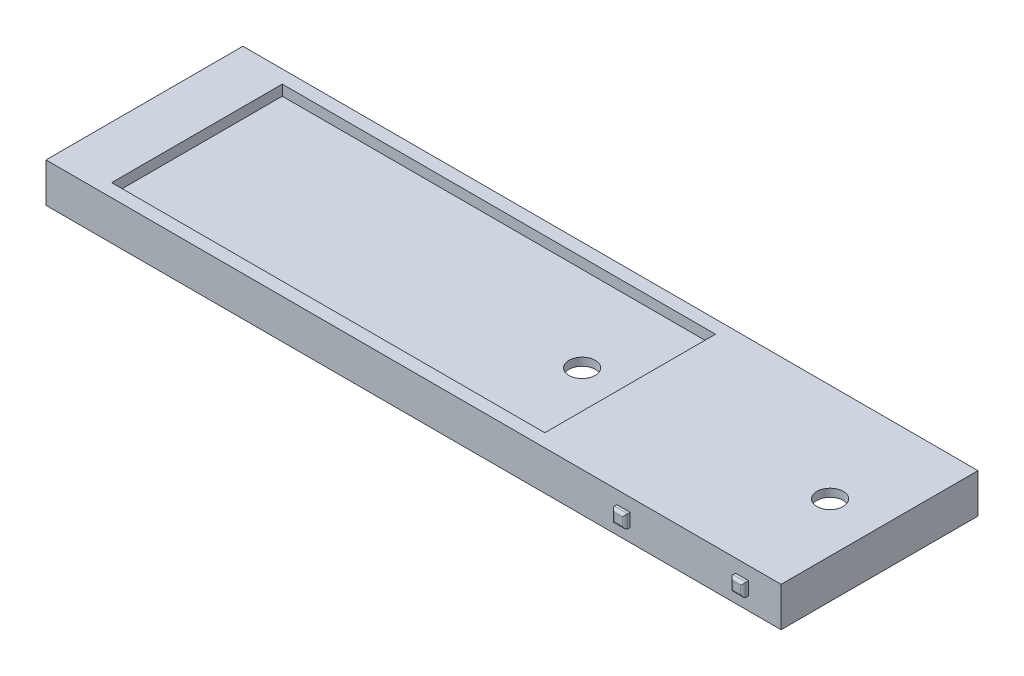
ISO-10303-21;
HEADER;
FILE_DESCRIPTION(('STEP AP214'),'2;1');
FILE_NAME('part.step','',(''),(''),'','','');
FILE_SCHEMA(('AUTOMOTIVE_DESIGN { 1 0 10303 214 1 1 1 1 }'));
ENDSEC;
DATA;
#1=APPLICATION_CONTEXT('core data for automotive mechanical design processes');
#2=APPLICATION_PROTOCOL_DEFINITION('international standard','automotive_design',2000,#1);
#3=PRODUCT_CONTEXT('',#1,'mechanical');
#4=PRODUCT('Part','Part','',(#3));
#5=PRODUCT_RELATED_PRODUCT_CATEGORY('part','',(#4));
#6=PRODUCT_DEFINITION_FORMATION('','',#4);
#7=PRODUCT_DEFINITION_CONTEXT('part definition',#1,'design');
#8=PRODUCT_DEFINITION('design','',#6,#7);
#9=PRODUCT_DEFINITION_SHAPE('','',#8);
#10=(LENGTH_UNIT() NAMED_UNIT(*) SI_UNIT(.MILLI.,.METRE.));
#11=(NAMED_UNIT(*) PLANE_ANGLE_UNIT() SI_UNIT($,.RADIAN.));
#12=(NAMED_UNIT(*) SI_UNIT($,.STERADIAN.) SOLID_ANGLE_UNIT());
#13=UNCERTAINTY_MEASURE_WITH_UNIT(LENGTH_MEASURE(1.E-05),#10,'distance_accuracy_value','');
#14=(GEOMETRIC_REPRESENTATION_CONTEXT(3) GLOBAL_UNCERTAINTY_ASSIGNED_CONTEXT((#13)) GLOBAL_UNIT_ASSIGNED_CONTEXT((#10,
#11,#12)) REPRESENTATION_CONTEXT('',''));
#15=CARTESIAN_POINT('',(0.,0.,0.));
#16=DIRECTION('',(0.,0.,1.));
#17=DIRECTION('',(1.,0.,0.));
#18=AXIS2_PLACEMENT_3D('',#15,#16,#17);
#19=CARTESIAN_POINT('',(-140.,15.,37.5));
#20=DIRECTION('',(0.,0.,-1.));
#21=DIRECTION('',(-1.,0.,0.));
#22=AXIS2_PLACEMENT_3D('',#19,#20,#21);
#23=PLANE('',#22);
#24=DIRECTION('',(0.,1.,0.));
#25=VECTOR('',#24,1.);
#26=CARTESIAN_POINT('',(82.5000000000001,10.,37.5));
#27=LINE('',#26,#25);
#28=CARTESIAN_POINT('',(82.5000000000001,5.,37.5));
#29=VERTEX_POINT('',#28);
#30=CARTESIAN_POINT('',(82.5000000000001,10.,37.5));
#31=VERTEX_POINT('',#30);
#32=EDGE_CURVE('E254',#29,#31,#27,.T.);
#33=ORIENTED_EDGE('',*,*,#32,.F.);
#34=DIRECTION('',(1.,0.,0.));
#35=VECTOR('',#34,1.);
#36=CARTESIAN_POINT('',(77.5000000000001,5.,37.5));
#37=LINE('',#36,#35);
#38=CARTESIAN_POINT('',(77.5000000000001,5.,37.5));
#39=VERTEX_POINT('',#38);
#40=EDGE_CURVE('E272',#39,#29,#37,.T.);
#41=ORIENTED_EDGE('',*,*,#40,.F.);
#42=DIRECTION('',(0.,-1.,0.));
#43=VECTOR('',#42,1.);
#44=CARTESIAN_POINT('',(77.5000000000001,10.,37.5));
#45=LINE('',#44,#43);
#46=CARTESIAN_POINT('',(77.5000000000001,10.,37.5));
#47=VERTEX_POINT('',#46);
#48=EDGE_CURVE('E269',#47,#39,#45,.T.);
#49=ORIENTED_EDGE('',*,*,#48,.F.);
#50=DIRECTION('',(-1.,0.,0.));
#51=VECTOR('',#50,1.);
#52=CARTESIAN_POINT('',(77.5000000000001,10.,37.5));
#53=LINE('',#52,#51);
#54=EDGE_CURVE('E266',#31,#47,#53,.T.);
#55=ORIENTED_EDGE('',*,*,#54,.F.);
#56=EDGE_LOOP('',(#33,#41,#49,#55));
#57=FACE_BOUND('',#56,.T.);
#58=DIRECTION('',(1.,0.,0.));
#59=VECTOR('',#58,1.);
#60=CARTESIAN_POINT('',(-140.,0.,37.5));
#61=LINE('',#60,#59);
#62=CARTESIAN_POINT('',(-140.,0.,37.5));
#63=VERTEX_POINT('',#62);
#64=CARTESIAN_POINT('',(140.,0.,37.5));
#65=VERTEX_POINT('',#64);
#66=EDGE_CURVE('E391',#63,#65,#61,.T.);
#67=ORIENTED_EDGE('',*,*,#66,.T.);
#68=DIRECTION('',(0.,-1.,0.));
#69=VECTOR('',#68,1.);
#70=CARTESIAN_POINT('',(140.,15.,37.5));
#71=LINE('',#70,#69);
#72=CARTESIAN_POINT('',(140.,15.,37.5));
#73=VERTEX_POINT('',#72);
#74=EDGE_CURVE('E397',#73,#65,#71,.T.);
#75=ORIENTED_EDGE('',*,*,#74,.F.);
#76=DIRECTION('',(1.,0.,0.));
#77=VECTOR('',#76,1.);
#78=CARTESIAN_POINT('',(-140.,15.,37.5));
#79=LINE('',#78,#77);
#80=CARTESIAN_POINT('',(-140.,15.,37.5));
#81=VERTEX_POINT('',#80);
#82=EDGE_CURVE('E395',#81,#73,#79,.T.);
#83=ORIENTED_EDGE('',*,*,#82,.F.);
#84=DIRECTION('',(0.,-1.,0.));
#85=VECTOR('',#84,1.);
#86=CARTESIAN_POINT('',(-140.,15.,37.5));
#87=LINE('',#86,#85);
#88=EDGE_CURVE('E409',#81,#63,#87,.T.);
#89=ORIENTED_EDGE('',*,*,#88,.T.);
#90=EDGE_LOOP('',(#67,#75,#83,#89));
#91=FACE_BOUND('',#90,.T.);
#92=DIRECTION('',(0.,1.,0.));
#93=VECTOR('',#92,1.);
#94=CARTESIAN_POINT('',(127.624035554911,10.,37.5));
#95=LINE('',#94,#93);
#96=CARTESIAN_POINT('',(127.624035554911,5.,37.5));
#97=VERTEX_POINT('',#96);
#98=CARTESIAN_POINT('',(127.624035554912,10.,37.5));
#99=VERTEX_POINT('',#98);
#100=EDGE_CURVE('E237',#97,#99,#95,.T.);
#101=ORIENTED_EDGE('',*,*,#100,.F.);
#102=DIRECTION('',(1.,0.,0.));
#103=VECTOR('',#102,1.);
#104=CARTESIAN_POINT('',(122.624035554911,5.,37.5));
#105=LINE('',#104,#103);
#106=CARTESIAN_POINT('',(122.624035554911,5.,37.5));
#107=VERTEX_POINT('',#106);
#108=EDGE_CURVE('E244',#107,#97,#105,.T.);
#109=ORIENTED_EDGE('',*,*,#108,.F.);
#110=DIRECTION('',(0.,-1.,0.));
#111=VECTOR('',#110,1.);
#112=CARTESIAN_POINT('',(122.624035554911,10.,37.5));
#113=LINE('',#112,#111);
#114=CARTESIAN_POINT('',(122.624035554911,10.,37.5));
#115=VERTEX_POINT('',#114);
#116=EDGE_CURVE('E258',#115,#107,#113,.T.);
#117=ORIENTED_EDGE('',*,*,#116,.F.);
#118=DIRECTION('',(-1.,0.,0.));
#119=VECTOR('',#118,1.);
#120=CARTESIAN_POINT('',(122.624035554911,10.,37.5));
#121=LINE('',#120,#119);
#122=EDGE_CURVE('E253',#99,#115,#121,.T.);
#123=ORIENTED_EDGE('',*,*,#122,.F.);
#124=EDGE_LOOP('',(#101,#109,#117,#123));
#125=FACE_BOUND('',#124,.T.);
#126=ADVANCED_FACE('F47',(#57,#91,#125),#23,.F.);
#127=CARTESIAN_POINT('',(121.166163262817,0.,0.));
#128=DIRECTION('',(0.,1.,0.));
#129=DIRECTION('',(0.,0.,1.));
#130=AXIS2_PLACEMENT_3D('',#127,#128,#129);
#131=CYLINDRICAL_SURFACE('',#130,5.);
#132=CARTESIAN_POINT('',(121.166163262817,15.,0.));
#133=DIRECTION('',(0.,1.,0.));
#134=DIRECTION('',(0.,0.,1.));
#135=AXIS2_PLACEMENT_3D('',#132,#133,#134);
#136=CIRCLE('',#135,5.);
#137=CARTESIAN_POINT('',(121.166163262817,15.,5.));
#138=VERTEX_POINT('',#137);
#139=EDGE_CURVE('E383',#138,#138,#136,.T.);
#140=ORIENTED_EDGE('',*,*,#139,.T.);
#141=EDGE_LOOP('',(#140));
#142=FACE_BOUND('',#141,.T.);
#143=CARTESIAN_POINT('',(121.166163262817,12.,0.));
#144=DIRECTION('',(0.,1.,0.));
#145=DIRECTION('',(0.,0.,1.));
#146=AXIS2_PLACEMENT_3D('',#143,#144,#145);
#147=CIRCLE('',#146,5.);
#148=CARTESIAN_POINT('',(121.166163262817,12.,5.));
#149=VERTEX_POINT('',#148);
#150=EDGE_CURVE('E321',#149,#149,#147,.T.);
#151=ORIENTED_EDGE('',*,*,#150,.F.);
#152=EDGE_LOOP('',(#151));
#153=FACE_BOUND('',#152,.T.);
#154=ADVANCED_FACE('F505',(#142,#153),#131,.F.);
#155=CARTESIAN_POINT('',(26.6982684733857,0.,0.));
#156=DIRECTION('',(0.,1.,0.));
#157=DIRECTION('',(0.,0.,1.));
#158=AXIS2_PLACEMENT_3D('',#155,#156,#157);
#159=CYLINDRICAL_SURFACE('',#158,5.);
#160=CARTESIAN_POINT('',(26.6982684733857,8.,0.));
#161=DIRECTION('',(0.,1.,0.));
#162=DIRECTION('',(0.,0.,1.));
#163=AXIS2_PLACEMENT_3D('',#160,#161,#162);
#164=CIRCLE('',#163,5.);
#165=CARTESIAN_POINT('',(26.6982684733857,8.,5.));
#166=VERTEX_POINT('',#165);
#167=EDGE_CURVE('E316',#166,#166,#164,.F.);
#168=ORIENTED_EDGE('',*,*,#167,.T.);
#169=EDGE_LOOP('',(#168));
#170=FACE_BOUND('',#169,.T.);
#171=CARTESIAN_POINT('',(26.6982684733857,11.,0.));
#172=DIRECTION('',(0.,1.,0.));
#173=DIRECTION('',(0.,0.,1.));
#174=AXIS2_PLACEMENT_3D('',#171,#172,#173);
#175=CIRCLE('',#174,5.);
#176=CARTESIAN_POINT('',(26.6982684733857,11.,5.));
#177=VERTEX_POINT('',#176);
#178=EDGE_CURVE('E376',#177,#177,#175,.F.);
#179=ORIENTED_EDGE('',*,*,#178,.F.);
#180=EDGE_LOOP('',(#179));
#181=FACE_BOUND('',#180,.T.);
#182=ADVANCED_FACE('F513',(#170,#181),#159,.F.);
#183=CARTESIAN_POINT('',(140.,15.,-37.5));
#184=DIRECTION('',(-1.,0.,0.));
#185=DIRECTION('',(0.,0.,1.));
#186=AXIS2_PLACEMENT_3D('',#183,#184,#185);
#187=PLANE('',#186);
#188=DIRECTION('',(0.,0.,-1.));
#189=VECTOR('',#188,1.);
#190=CARTESIAN_POINT('',(140.,0.,-37.5));
#191=LINE('',#190,#189);
#192=CARTESIAN_POINT('',(140.,0.,-37.5));
#193=VERTEX_POINT('',#192);
#194=EDGE_CURVE('E386',#65,#193,#191,.T.);
#195=ORIENTED_EDGE('',*,*,#194,.T.);
#196=DIRECTION('',(0.,-1.,0.));
#197=VECTOR('',#196,1.);
#198=CARTESIAN_POINT('',(140.,15.,-37.5));
#199=LINE('',#198,#197);
#200=CARTESIAN_POINT('',(140.,15.,-37.5));
#201=VERTEX_POINT('',#200);
#202=EDGE_CURVE('E415',#201,#193,#199,.T.);
#203=ORIENTED_EDGE('',*,*,#202,.F.);
#204=DIRECTION('',(0.,0.,-1.));
#205=VECTOR('',#204,1.);
#206=CARTESIAN_POINT('',(140.,15.,-37.5));
#207=LINE('',#206,#205);
#208=EDGE_CURVE('E387',#73,#201,#207,.T.);
#209=ORIENTED_EDGE('',*,*,#208,.F.);
#210=ORIENTED_EDGE('',*,*,#74,.T.);
#211=EDGE_LOOP('',(#195,#203,#209,#210));
#212=FACE_BOUND('',#211,.T.);
#213=ADVANCED_FACE('F529',(#212),#187,.F.);
#214=CARTESIAN_POINT('',(-140.,15.,-37.5));
#215=DIRECTION('',(0.,0.,1.));
#216=DIRECTION('',(1.,0.,0.));
#217=AXIS2_PLACEMENT_3D('',#214,#215,#216);
#218=PLANE('',#217);
#219=DIRECTION('',(-1.,0.,0.));
#220=VECTOR('',#219,1.);
#221=CARTESIAN_POINT('',(-140.,0.,-37.5));
#222=LINE('',#221,#220);
#223=CARTESIAN_POINT('',(-140.,0.,-37.5));
#224=VERTEX_POINT('',#223);
#225=EDGE_CURVE('E400',#193,#224,#222,.T.);
#226=ORIENTED_EDGE('',*,*,#225,.T.);
#227=DIRECTION('',(0.,-1.,0.));
#228=VECTOR('',#227,1.);
#229=CARTESIAN_POINT('',(-140.,15.,-37.5));
#230=LINE('',#229,#228);
#231=CARTESIAN_POINT('',(-140.,15.,-37.5));
#232=VERTEX_POINT('',#231);
#233=EDGE_CURVE('E412',#232,#224,#230,.T.);
#234=ORIENTED_EDGE('',*,*,#233,.F.);
#235=DIRECTION('',(-1.,0.,0.));
#236=VECTOR('',#235,1.);
#237=CARTESIAN_POINT('',(-140.,15.,-37.5));
#238=LINE('',#237,#236);
#239=EDGE_CURVE('E390',#201,#232,#238,.T.);
#240=ORIENTED_EDGE('',*,*,#239,.F.);
#241=ORIENTED_EDGE('',*,*,#202,.T.);
#242=EDGE_LOOP('',(#226,#234,#240,#241));
#243=FACE_BOUND('',#242,.T.);
#244=ADVANCED_FACE('F525',(#243),#218,.F.);
#245=CARTESIAN_POINT('',(-140.,15.,-37.5));
#246=DIRECTION('',(1.,0.,0.));
#247=DIRECTION('',(0.,0.,-1.));
#248=AXIS2_PLACEMENT_3D('',#245,#246,#247);
#249=PLANE('',#248);
#250=DIRECTION('',(0.,0.,1.));
#251=VECTOR('',#250,1.);
#252=CARTESIAN_POINT('',(-140.,12.,-37.5));
#253=LINE('',#252,#251);
#254=CARTESIAN_POINT('',(-140.,12.,-34.5));
#255=VERTEX_POINT('',#254);
#256=CARTESIAN_POINT('',(-140.,12.,34.5));
#257=VERTEX_POINT('',#256);
#258=EDGE_CURVE('E301',#255,#257,#253,.T.);
#259=ORIENTED_EDGE('',*,*,#258,.T.);
#260=DIRECTION('',(0.,-1.,0.));
#261=VECTOR('',#260,1.);
#262=CARTESIAN_POINT('',(-140.,15.,34.5));
#263=LINE('',#262,#261);
#264=CARTESIAN_POINT('',(-140.,0.,34.5));
#265=VERTEX_POINT('',#264);
#266=EDGE_CURVE('E296',#257,#265,#263,.T.);
#267=ORIENTED_EDGE('',*,*,#266,.T.);
#268=DIRECTION('',(0.,0.,1.));
#269=VECTOR('',#268,1.);
#270=CARTESIAN_POINT('',(-140.,0.,-37.5));
#271=LINE('',#270,#269);
#272=EDGE_CURVE('E402',#265,#63,#271,.T.);
#273=ORIENTED_EDGE('',*,*,#272,.T.);
#274=ORIENTED_EDGE('',*,*,#88,.F.);
#275=DIRECTION('',(0.,0.,1.));
#276=VECTOR('',#275,1.);
#277=CARTESIAN_POINT('',(-140.,15.,-37.5));
#278=LINE('',#277,#276);
#279=EDGE_CURVE('E393',#232,#81,#278,.T.);
#280=ORIENTED_EDGE('',*,*,#279,.F.);
#281=ORIENTED_EDGE('',*,*,#233,.T.);
#282=CARTESIAN_POINT('',(-140.,0.,-34.5));
#283=VERTEX_POINT('',#282);
#284=EDGE_CURVE('E403',#224,#283,#271,.T.);
#285=ORIENTED_EDGE('',*,*,#284,.T.);
#286=DIRECTION('',(0.,-1.,0.));
#287=VECTOR('',#286,1.);
#288=CARTESIAN_POINT('',(-140.,15.,-34.5));
#289=LINE('',#288,#287);
#290=EDGE_CURVE('E288',#255,#283,#289,.T.);
#291=ORIENTED_EDGE('',*,*,#290,.F.);
#292=EDGE_LOOP('',(#259,#267,#273,#274,#280,#281,#285,#291));
#293=FACE_BOUND('',#292,.T.);
#294=ADVANCED_FACE('F521',(#293),#249,.F.);
#295=CARTESIAN_POINT('',(0.,15.,0.));
#296=DIRECTION('',(0.,1.,0.));
#297=DIRECTION('',(0.,0.,1.));
#298=AXIS2_PLACEMENT_3D('',#295,#296,#297);
#299=PLANE('',#298);
#300=DIRECTION('',(0.,0.,1.));
#301=VECTOR('',#300,1.);
#302=CARTESIAN_POINT('',(-120.,15.,-32.5));
#303=LINE('',#302,#301);
#304=CARTESIAN_POINT('',(-120.,15.,-32.5));
#305=VERTEX_POINT('',#304);
#306=CARTESIAN_POINT('',(-120.,15.,32.5));
#307=VERTEX_POINT('',#306);
#308=EDGE_CURVE('E350',#305,#307,#303,.T.);
#309=ORIENTED_EDGE('',*,*,#308,.F.);
#310=DIRECTION('',(-1.,0.,0.));
#311=VECTOR('',#310,1.);
#312=CARTESIAN_POINT('',(-120.,15.,-32.5));
#313=LINE('',#312,#311);
#314=CARTESIAN_POINT('',(45.0000000000001,15.,-32.5));
#315=VERTEX_POINT('',#314);
#316=EDGE_CURVE('E355',#315,#305,#313,.T.);
#317=ORIENTED_EDGE('',*,*,#316,.F.);
#318=DIRECTION('',(0.,0.,-1.));
#319=VECTOR('',#318,1.);
#320=CARTESIAN_POINT('',(45.0000000000001,15.,-32.5));
#321=LINE('',#320,#319);
#322=CARTESIAN_POINT('',(45.0000000000001,15.,32.5));
#323=VERTEX_POINT('',#322);
#324=EDGE_CURVE('E369',#323,#315,#321,.T.);
#325=ORIENTED_EDGE('',*,*,#324,.F.);
#326=DIRECTION('',(1.,0.,0.));
#327=VECTOR('',#326,1.);
#328=CARTESIAN_POINT('',(-120.,15.,32.5));
#329=LINE('',#328,#327);
#330=EDGE_CURVE('E366',#307,#323,#329,.T.);
#331=ORIENTED_EDGE('',*,*,#330,.F.);
#332=EDGE_LOOP('',(#309,#317,#325,#331));
#333=FACE_BOUND('',#332,.T.);
#334=ORIENTED_EDGE('',*,*,#139,.F.);
#335=EDGE_LOOP('',(#334));
#336=FACE_BOUND('',#335,.T.);
#337=ORIENTED_EDGE('',*,*,#208,.T.);
#338=ORIENTED_EDGE('',*,*,#239,.T.);
#339=ORIENTED_EDGE('',*,*,#279,.T.);
#340=ORIENTED_EDGE('',*,*,#82,.T.);
#341=EDGE_LOOP('',(#337,#338,#339,#340));
#342=FACE_BOUND('',#341,.T.);
#343=ADVANCED_FACE('F524',(#333,#336,#342),#299,.T.);
#344=CARTESIAN_POINT('',(0.,0.,0.));
#345=DIRECTION('',(0.,1.,0.));
#346=DIRECTION('',(0.,0.,1.));
#347=AXIS2_PLACEMENT_3D('',#344,#345,#346);
#348=PLANE('',#347);
#349=ORIENTED_EDGE('',*,*,#272,.F.);
#350=DIRECTION('',(1.,0.,0.));
#351=VECTOR('',#350,1.);
#352=CARTESIAN_POINT('',(-140.,0.,34.5));
#353=LINE('',#352,#351);
#354=CARTESIAN_POINT('',(137.,0.,34.5));
#355=VERTEX_POINT('',#354);
#356=EDGE_CURVE('E293',#265,#355,#353,.T.);
#357=ORIENTED_EDGE('',*,*,#356,.T.);
#358=DIRECTION('',(0.,0.,-1.));
#359=VECTOR('',#358,1.);
#360=CARTESIAN_POINT('',(137.,0.,-37.5));
#361=LINE('',#360,#359);
#362=CARTESIAN_POINT('',(137.,0.,-34.5));
#363=VERTEX_POINT('',#362);
#364=EDGE_CURVE('E317',#355,#363,#361,.T.);
#365=ORIENTED_EDGE('',*,*,#364,.T.);
#366=DIRECTION('',(-1.,0.,0.));
#367=VECTOR('',#366,1.);
#368=CARTESIAN_POINT('',(-140.,0.,-34.5));
#369=LINE('',#368,#367);
#370=EDGE_CURVE('E320',#363,#283,#369,.T.);
#371=ORIENTED_EDGE('',*,*,#370,.T.);
#372=ORIENTED_EDGE('',*,*,#284,.F.);
#373=ORIENTED_EDGE('',*,*,#225,.F.);
#374=ORIENTED_EDGE('',*,*,#194,.F.);
#375=ORIENTED_EDGE('',*,*,#66,.F.);
#376=EDGE_LOOP('',(#349,#357,#365,#371,#372,#373,#374,#375));
#377=FACE_BOUND('',#376,.T.);
#378=ADVANCED_FACE('F519',(#377),#348,.F.);
#379=CARTESIAN_POINT('',(0.,11.,0.));
#380=DIRECTION('',(0.,1.,0.));
#381=DIRECTION('',(0.,0.,1.));
#382=AXIS2_PLACEMENT_3D('',#379,#380,#381);
#383=PLANE('',#382);
#384=DIRECTION('',(0.,0.,1.));
#385=VECTOR('',#384,1.);
#386=CARTESIAN_POINT('',(-120.,11.,-32.5));
#387=LINE('',#386,#385);
#388=CARTESIAN_POINT('',(-120.,11.,-32.5));
#389=VERTEX_POINT('',#388);
#390=CARTESIAN_POINT('',(-120.,11.,32.5));
#391=VERTEX_POINT('',#390);
#392=EDGE_CURVE('E351',#389,#391,#387,.T.);
#393=ORIENTED_EDGE('',*,*,#392,.T.);
#394=DIRECTION('',(1.,0.,0.));
#395=VECTOR('',#394,1.);
#396=CARTESIAN_POINT('',(-120.,11.,32.5));
#397=LINE('',#396,#395);
#398=CARTESIAN_POINT('',(45.0000000000001,11.,32.5));
#399=VERTEX_POINT('',#398);
#400=EDGE_CURVE('E354',#391,#399,#397,.T.);
#401=ORIENTED_EDGE('',*,*,#400,.T.);
#402=DIRECTION('',(0.,0.,-1.));
#403=VECTOR('',#402,1.);
#404=CARTESIAN_POINT('',(45.0000000000001,11.,-32.5));
#405=LINE('',#404,#403);
#406=CARTESIAN_POINT('',(45.0000000000001,11.,-32.5));
#407=VERTEX_POINT('',#406);
#408=EDGE_CURVE('E358',#399,#407,#405,.T.);
#409=ORIENTED_EDGE('',*,*,#408,.T.);
#410=DIRECTION('',(-1.,0.,0.));
#411=VECTOR('',#410,1.);
#412=CARTESIAN_POINT('',(-120.,11.,-32.5));
#413=LINE('',#412,#411);
#414=EDGE_CURVE('E361',#407,#389,#413,.T.);
#415=ORIENTED_EDGE('',*,*,#414,.T.);
#416=EDGE_LOOP('',(#393,#401,#409,#415));
#417=FACE_BOUND('',#416,.T.);
#418=ORIENTED_EDGE('',*,*,#178,.T.);
#419=EDGE_LOOP('',(#418));
#420=FACE_BOUND('',#419,.T.);
#421=ADVANCED_FACE('F779',(#417,#420),#383,.T.);
#422=CARTESIAN_POINT('',(-120.,11.,-32.5));
#423=DIRECTION('',(-1.,0.,0.));
#424=DIRECTION('',(0.,0.,1.));
#425=AXIS2_PLACEMENT_3D('',#422,#423,#424);
#426=PLANE('',#425);
#427=ORIENTED_EDGE('',*,*,#308,.T.);
#428=DIRECTION('',(0.,1.,0.));
#429=VECTOR('',#428,1.);
#430=CARTESIAN_POINT('',(-120.,11.,32.5));
#431=LINE('',#430,#429);
#432=EDGE_CURVE('E364',#391,#307,#431,.T.);
#433=ORIENTED_EDGE('',*,*,#432,.F.);
#434=ORIENTED_EDGE('',*,*,#392,.F.);
#435=DIRECTION('',(0.,1.,0.));
#436=VECTOR('',#435,1.);
#437=CARTESIAN_POINT('',(-120.,11.,-32.5));
#438=LINE('',#437,#436);
#439=EDGE_CURVE('E374',#389,#305,#438,.T.);
#440=ORIENTED_EDGE('',*,*,#439,.T.);
#441=EDGE_LOOP('',(#427,#433,#434,#440));
#442=FACE_BOUND('',#441,.T.);
#443=ADVANCED_FACE('F769',(#442),#426,.F.);
#444=CARTESIAN_POINT('',(-120.,11.,-32.5));
#445=DIRECTION('',(0.,0.,-1.));
#446=DIRECTION('',(-1.,0.,0.));
#447=AXIS2_PLACEMENT_3D('',#444,#445,#446);
#448=PLANE('',#447);
#449=ORIENTED_EDGE('',*,*,#316,.T.);
#450=ORIENTED_EDGE('',*,*,#439,.F.);
#451=ORIENTED_EDGE('',*,*,#414,.F.);
#452=DIRECTION('',(0.,1.,0.));
#453=VECTOR('',#452,1.);
#454=CARTESIAN_POINT('',(45.0000000000001,11.,-32.5));
#455=LINE('',#454,#453);
#456=EDGE_CURVE('E377',#407,#315,#455,.T.);
#457=ORIENTED_EDGE('',*,*,#456,.T.);
#458=EDGE_LOOP('',(#449,#450,#451,#457));
#459=FACE_BOUND('',#458,.T.);
#460=ADVANCED_FACE('F759',(#459),#448,.F.);
#461=CARTESIAN_POINT('',(45.0000000000001,11.,-32.5));
#462=DIRECTION('',(1.,0.,0.));
#463=DIRECTION('',(0.,0.,-1.));
#464=AXIS2_PLACEMENT_3D('',#461,#462,#463);
#465=PLANE('',#464);
#466=ORIENTED_EDGE('',*,*,#324,.T.);
#467=ORIENTED_EDGE('',*,*,#456,.F.);
#468=ORIENTED_EDGE('',*,*,#408,.F.);
#469=DIRECTION('',(0.,1.,0.));
#470=VECTOR('',#469,1.);
#471=CARTESIAN_POINT('',(45.0000000000001,11.,32.5));
#472=LINE('',#471,#470);
#473=EDGE_CURVE('E379',#399,#323,#472,.T.);
#474=ORIENTED_EDGE('',*,*,#473,.T.);
#475=EDGE_LOOP('',(#466,#467,#468,#474));
#476=FACE_BOUND('',#475,.T.);
#477=ADVANCED_FACE('F749',(#476),#465,.F.);
#478=CARTESIAN_POINT('',(-120.,11.,32.5));
#479=DIRECTION('',(0.,0.,1.));
#480=DIRECTION('',(1.,0.,0.));
#481=AXIS2_PLACEMENT_3D('',#478,#479,#480);
#482=PLANE('',#481);
#483=ORIENTED_EDGE('',*,*,#330,.T.);
#484=ORIENTED_EDGE('',*,*,#473,.F.);
#485=ORIENTED_EDGE('',*,*,#400,.F.);
#486=ORIENTED_EDGE('',*,*,#432,.T.);
#487=EDGE_LOOP('',(#483,#484,#485,#486));
#488=FACE_BOUND('',#487,.T.);
#489=ADVANCED_FACE('F688',(#488),#482,.F.);
#490=CARTESIAN_POINT('',(0.,8.,0.));
#491=DIRECTION('',(0.,1.,0.));
#492=DIRECTION('',(0.,0.,1.));
#493=AXIS2_PLACEMENT_3D('',#490,#491,#492);
#494=PLANE('',#493);
#495=ORIENTED_EDGE('',*,*,#167,.F.);
#496=EDGE_LOOP('',(#495));
#497=FACE_BOUND('',#496,.T.);
#498=DIRECTION('',(-1.,0.,0.));
#499=VECTOR('',#498,1.);
#500=CARTESIAN_POINT('',(0.,8.,34.5));
#501=LINE('',#500,#499);
#502=CARTESIAN_POINT('',(48.,8.,34.5));
#503=VERTEX_POINT('',#502);
#504=CARTESIAN_POINT('',(-123.,8.,34.5));
#505=VERTEX_POINT('',#504);
#506=EDGE_CURVE('E348',#503,#505,#501,.T.);
#507=ORIENTED_EDGE('',*,*,#506,.T.);
#508=DIRECTION('',(0.,0.,1.));
#509=VECTOR('',#508,1.);
#510=CARTESIAN_POINT('',(-123.,8.,0.));
#511=LINE('',#510,#509);
#512=CARTESIAN_POINT('',(-123.,8.,-34.5));
#513=VERTEX_POINT('',#512);
#514=EDGE_CURVE('E307',#513,#505,#511,.T.);
#515=ORIENTED_EDGE('',*,*,#514,.F.);
#516=DIRECTION('',(-1.,0.,0.));
#517=VECTOR('',#516,1.);
#518=CARTESIAN_POINT('',(-140.,8.,-34.5));
#519=LINE('',#518,#517);
#520=CARTESIAN_POINT('',(48.0000000000001,8.,-34.5));
#521=VERTEX_POINT('',#520);
#522=EDGE_CURVE('E345',#521,#513,#519,.T.);
#523=ORIENTED_EDGE('',*,*,#522,.F.);
#524=DIRECTION('',(0.,0.,-1.));
#525=VECTOR('',#524,1.);
#526=CARTESIAN_POINT('',(48.0000000000001,8.,0.));
#527=LINE('',#526,#525);
#528=EDGE_CURVE('E313',#503,#521,#527,.T.);
#529=ORIENTED_EDGE('',*,*,#528,.F.);
#530=EDGE_LOOP('',(#507,#515,#523,#529));
#531=FACE_BOUND('',#530,.T.);
#532=ADVANCED_FACE('F681',(#497,#531),#494,.F.);
#533=CARTESIAN_POINT('',(-140.,15.,-34.5));
#534=DIRECTION('',(0.,0.,1.));
#535=DIRECTION('',(1.,0.,0.));
#536=AXIS2_PLACEMENT_3D('',#533,#534,#535);
#537=PLANE('',#536);
#538=ORIENTED_EDGE('',*,*,#522,.T.);
#539=DIRECTION('',(0.,-1.,0.));
#540=VECTOR('',#539,1.);
#541=CARTESIAN_POINT('',(-123.,15.,-34.5));
#542=LINE('',#541,#540);
#543=CARTESIAN_POINT('',(-123.,12.,-34.5));
#544=VERTEX_POINT('',#543);
#545=EDGE_CURVE('E287',#544,#513,#542,.T.);
#546=ORIENTED_EDGE('',*,*,#545,.F.);
#547=DIRECTION('',(-1.,0.,0.));
#548=VECTOR('',#547,1.);
#549=CARTESIAN_POINT('',(-140.,12.,-34.5));
#550=LINE('',#549,#548);
#551=EDGE_CURVE('E292',#544,#255,#550,.T.);
#552=ORIENTED_EDGE('',*,*,#551,.T.);
#553=ORIENTED_EDGE('',*,*,#290,.T.);
#554=ORIENTED_EDGE('',*,*,#370,.F.);
#555=DIRECTION('',(0.,-1.,0.));
#556=VECTOR('',#555,1.);
#557=CARTESIAN_POINT('',(137.,15.,-34.5));
#558=LINE('',#557,#556);
#559=CARTESIAN_POINT('',(137.,12.,-34.5));
#560=VERTEX_POINT('',#559);
#561=EDGE_CURVE('E284',#560,#363,#558,.T.);
#562=ORIENTED_EDGE('',*,*,#561,.F.);
#563=CARTESIAN_POINT('',(48.,12.,-34.5));
#564=VERTEX_POINT('',#563);
#565=EDGE_CURVE('E298',#560,#564,#550,.T.);
#566=ORIENTED_EDGE('',*,*,#565,.T.);
#567=DIRECTION('',(0.,-1.,0.));
#568=VECTOR('',#567,1.);
#569=CARTESIAN_POINT('',(48.0000000000001,11.,-34.5));
#570=LINE('',#569,#568);
#571=EDGE_CURVE('E339',#564,#521,#570,.T.);
#572=ORIENTED_EDGE('',*,*,#571,.T.);
#573=EDGE_LOOP('',(#538,#546,#552,#553,#554,#562,#566,#572));
#574=FACE_BOUND('',#573,.T.);
#575=ADVANCED_FACE('F687',(#574),#537,.T.);
#576=CARTESIAN_POINT('',(0.,12.,0.));
#577=DIRECTION('',(0.,1.,0.));
#578=DIRECTION('',(0.,0.,1.));
#579=AXIS2_PLACEMENT_3D('',#576,#577,#578);
#580=PLANE('',#579);
#581=DIRECTION('',(0.,0.,1.));
#582=VECTOR('',#581,1.);
#583=CARTESIAN_POINT('',(-123.,12.,0.));
#584=LINE('',#583,#582);
#585=CARTESIAN_POINT('',(-123.,12.,34.5));
#586=VERTEX_POINT('',#585);
#587=EDGE_CURVE('E283',#544,#586,#584,.T.);
#588=ORIENTED_EDGE('',*,*,#587,.T.);
#589=DIRECTION('',(1.,0.,0.));
#590=VECTOR('',#589,1.);
#591=CARTESIAN_POINT('',(-140.,12.,34.5));
#592=LINE('',#591,#590);
#593=EDGE_CURVE('E297',#257,#586,#592,.T.);
#594=ORIENTED_EDGE('',*,*,#593,.F.);
#595=ORIENTED_EDGE('',*,*,#258,.F.);
#596=ORIENTED_EDGE('',*,*,#551,.F.);
#597=EDGE_LOOP('',(#588,#594,#595,#596));
#598=FACE_BOUND('',#597,.T.);
#599=ADVANCED_FACE('F697',(#598),#580,.F.);
#600=CARTESIAN_POINT('',(137.,15.,-37.5));
#601=DIRECTION('',(-1.,0.,0.));
#602=DIRECTION('',(0.,0.,1.));
#603=AXIS2_PLACEMENT_3D('',#600,#601,#602);
#604=PLANE('',#603);
#605=ORIENTED_EDGE('',*,*,#364,.F.);
#606=DIRECTION('',(0.,-1.,0.));
#607=VECTOR('',#606,1.);
#608=CARTESIAN_POINT('',(137.,15.,34.5));
#609=LINE('',#608,#607);
#610=CARTESIAN_POINT('',(137.,12.,34.5));
#611=VERTEX_POINT('',#610);
#612=EDGE_CURVE('E294',#611,#355,#609,.T.);
#613=ORIENTED_EDGE('',*,*,#612,.F.);
#614=DIRECTION('',(0.,0.,-1.));
#615=VECTOR('',#614,1.);
#616=CARTESIAN_POINT('',(137.,12.,-37.5));
#617=LINE('',#616,#615);
#618=EDGE_CURVE('E289',#611,#560,#617,.T.);
#619=ORIENTED_EDGE('',*,*,#618,.T.);
#620=ORIENTED_EDGE('',*,*,#561,.T.);
#621=EDGE_LOOP('',(#605,#613,#619,#620));
#622=FACE_BOUND('',#621,.T.);
#623=ADVANCED_FACE('F703',(#622),#604,.T.);
#624=CARTESIAN_POINT('',(-140.,15.,34.5));
#625=DIRECTION('',(0.,0.,-1.));
#626=DIRECTION('',(-1.,0.,0.));
#627=AXIS2_PLACEMENT_3D('',#624,#625,#626);
#628=PLANE('',#627);
#629=DIRECTION('',(0.,-1.,0.));
#630=VECTOR('',#629,1.);
#631=CARTESIAN_POINT('',(48.,15.,34.5));
#632=LINE('',#631,#630);
#633=CARTESIAN_POINT('',(48.,12.,34.5));
#634=VERTEX_POINT('',#633);
#635=EDGE_CURVE('E342',#634,#503,#632,.T.);
#636=ORIENTED_EDGE('',*,*,#635,.F.);
#637=EDGE_CURVE('E310',#634,#611,#592,.T.);
#638=ORIENTED_EDGE('',*,*,#637,.T.);
#639=ORIENTED_EDGE('',*,*,#612,.T.);
#640=ORIENTED_EDGE('',*,*,#356,.F.);
#641=ORIENTED_EDGE('',*,*,#266,.F.);
#642=ORIENTED_EDGE('',*,*,#593,.T.);
#643=DIRECTION('',(0.,-1.,0.));
#644=VECTOR('',#643,1.);
#645=CARTESIAN_POINT('',(-123.,11.,34.5));
#646=LINE('',#645,#644);
#647=EDGE_CURVE('E336',#586,#505,#646,.T.);
#648=ORIENTED_EDGE('',*,*,#647,.T.);
#649=ORIENTED_EDGE('',*,*,#506,.F.);
#650=EDGE_LOOP('',(#636,#638,#639,#640,#641,#642,#648,#649));
#651=FACE_BOUND('',#650,.T.);
#652=ADVANCED_FACE('F713',(#651),#628,.T.);
#653=ORIENTED_EDGE('',*,*,#565,.F.);
#654=ORIENTED_EDGE('',*,*,#618,.F.);
#655=ORIENTED_EDGE('',*,*,#637,.F.);
#656=DIRECTION('',(0.,0.,-1.));
#657=VECTOR('',#656,1.);
#658=CARTESIAN_POINT('',(48.0000000000001,12.,0.));
#659=LINE('',#658,#657);
#660=EDGE_CURVE('E304',#634,#564,#659,.T.);
#661=ORIENTED_EDGE('',*,*,#660,.T.);
#662=EDGE_LOOP('',(#653,#654,#655,#661));
#663=FACE_BOUND('',#662,.T.);
#664=ORIENTED_EDGE('',*,*,#150,.T.);
#665=EDGE_LOOP('',(#664));
#666=FACE_BOUND('',#665,.T.);
#667=ADVANCED_FACE('F674',(#663,#666),#580,.F.);
#668=CARTESIAN_POINT('',(-123.,11.,-32.5));
#669=DIRECTION('',(-1.,0.,0.));
#670=DIRECTION('',(0.,0.,1.));
#671=AXIS2_PLACEMENT_3D('',#668,#669,#670);
#672=PLANE('',#671);
#673=ORIENTED_EDGE('',*,*,#587,.F.);
#674=ORIENTED_EDGE('',*,*,#545,.T.);
#675=ORIENTED_EDGE('',*,*,#514,.T.);
#676=ORIENTED_EDGE('',*,*,#647,.F.);
#677=EDGE_LOOP('',(#673,#674,#675,#676));
#678=FACE_BOUND('',#677,.T.);
#679=ADVANCED_FACE('F664',(#678),#672,.T.);
#680=CARTESIAN_POINT('',(48.0000000000001,11.,-32.5));
#681=DIRECTION('',(1.,0.,0.));
#682=DIRECTION('',(0.,0.,-1.));
#683=AXIS2_PLACEMENT_3D('',#680,#681,#682);
#684=PLANE('',#683);
#685=ORIENTED_EDGE('',*,*,#635,.T.);
#686=ORIENTED_EDGE('',*,*,#528,.T.);
#687=ORIENTED_EDGE('',*,*,#571,.F.);
#688=ORIENTED_EDGE('',*,*,#660,.F.);
#689=EDGE_LOOP('',(#685,#686,#687,#688));
#690=FACE_BOUND('',#689,.T.);
#691=ADVANCED_FACE('F651',(#690),#684,.T.);
#692=CARTESIAN_POINT('',(82.5000000000001,10.,39.5));
#693=DIRECTION('',(-1.,0.,0.));
#694=DIRECTION('',(0.,0.,1.));
#695=AXIS2_PLACEMENT_3D('',#692,#693,#694);
#696=PLANE('',#695);
#697=DIRECTION('',(0.,0.,-1.));
#698=VECTOR('',#697,1.);
#699=CARTESIAN_POINT('',(82.5000000000001,10.,39.5));
#700=LINE('',#699,#698);
#701=CARTESIAN_POINT('',(82.5000000000001,10.,38.5));
#702=VERTEX_POINT('',#701);
#703=EDGE_CURVE('E281',#702,#31,#700,.T.);
#704=ORIENTED_EDGE('',*,*,#703,.F.);
#705=DIRECTION('',(0.,1.,0.));
#706=VECTOR('',#705,1.);
#707=CARTESIAN_POINT('',(82.5000000000001,5.,38.5));
#708=LINE('',#707,#706);
#709=CARTESIAN_POINT('',(82.5000000000001,5.,38.5));
#710=VERTEX_POINT('',#709);
#711=EDGE_CURVE('E11',#702,#710,#708,.F.);
#712=ORIENTED_EDGE('',*,*,#711,.T.);
#713=DIRECTION('',(0.,0.,-1.));
#714=VECTOR('',#713,1.);
#715=CARTESIAN_POINT('',(82.5000000000001,5.,39.5));
#716=LINE('',#715,#714);
#717=EDGE_CURVE('E275',#710,#29,#716,.T.);
#718=ORIENTED_EDGE('',*,*,#717,.T.);
#719=ORIENTED_EDGE('',*,*,#32,.T.);
#720=EDGE_LOOP('',(#704,#712,#718,#719));
#721=FACE_BOUND('',#720,.T.);
#722=ADVANCED_FACE('F482',(#721),#696,.F.);
#723=CARTESIAN_POINT('',(77.5000000000001,10.,39.5));
#724=DIRECTION('',(0.,-1.,0.));
#725=DIRECTION('',(0.,0.,-1.));
#726=AXIS2_PLACEMENT_3D('',#723,#724,#725);
#727=PLANE('',#726);
#728=DIRECTION('',(0.,0.,-1.));
#729=VECTOR('',#728,1.);
#730=CARTESIAN_POINT('',(77.5000000000001,10.,39.5));
#731=LINE('',#730,#729);
#732=CARTESIAN_POINT('',(77.5000000000001,10.,38.5));
#733=VERTEX_POINT('',#732);
#734=EDGE_CURVE('E279',#733,#47,#731,.T.);
#735=ORIENTED_EDGE('',*,*,#734,.F.);
#736=DIRECTION('',(-1.,0.,0.));
#737=VECTOR('',#736,1.);
#738=CARTESIAN_POINT('',(82.5000000000001,10.,38.5));
#739=LINE('',#738,#737);
#740=EDGE_CURVE('E56',#733,#702,#739,.F.);
#741=ORIENTED_EDGE('',*,*,#740,.T.);
#742=ORIENTED_EDGE('',*,*,#703,.T.);
#743=ORIENTED_EDGE('',*,*,#54,.T.);
#744=EDGE_LOOP('',(#735,#741,#742,#743));
#745=FACE_BOUND('',#744,.T.);
#746=ADVANCED_FACE('F636',(#745),#727,.F.);
#747=CARTESIAN_POINT('',(77.5000000000001,10.,39.5));
#748=DIRECTION('',(1.,0.,0.));
#749=DIRECTION('',(0.,0.,-1.));
#750=AXIS2_PLACEMENT_3D('',#747,#748,#749);
#751=PLANE('',#750);
#752=DIRECTION('',(0.,0.,-1.));
#753=VECTOR('',#752,1.);
#754=CARTESIAN_POINT('',(77.5000000000001,5.,39.5));
#755=LINE('',#754,#753);
#756=CARTESIAN_POINT('',(77.5000000000001,5.,38.5));
#757=VERTEX_POINT('',#756);
#758=EDGE_CURVE('E277',#757,#39,#755,.T.);
#759=ORIENTED_EDGE('',*,*,#758,.F.);
#760=DIRECTION('',(0.,-1.,0.));
#761=VECTOR('',#760,1.);
#762=CARTESIAN_POINT('',(77.5000000000001,10.,38.5));
#763=LINE('',#762,#761);
#764=EDGE_CURVE('E71',#757,#733,#763,.F.);
#765=ORIENTED_EDGE('',*,*,#764,.T.);
#766=ORIENTED_EDGE('',*,*,#734,.T.);
#767=ORIENTED_EDGE('',*,*,#48,.T.);
#768=EDGE_LOOP('',(#759,#765,#766,#767));
#769=FACE_BOUND('',#768,.T.);
#770=ADVANCED_FACE('F501',(#769),#751,.F.);
#771=CARTESIAN_POINT('',(77.5000000000001,5.,39.5));
#772=DIRECTION('',(0.,1.,0.));
#773=DIRECTION('',(0.,0.,1.));
#774=AXIS2_PLACEMENT_3D('',#771,#772,#773);
#775=PLANE('',#774);
#776=ORIENTED_EDGE('',*,*,#717,.F.);
#777=DIRECTION('',(1.,0.,0.));
#778=VECTOR('',#777,1.);
#779=CARTESIAN_POINT('',(77.5000000000001,5.,38.5));
#780=LINE('',#779,#778);
#781=EDGE_CURVE('E445',#710,#757,#780,.F.);
#782=ORIENTED_EDGE('',*,*,#781,.T.);
#783=ORIENTED_EDGE('',*,*,#758,.T.);
#784=ORIENTED_EDGE('',*,*,#40,.T.);
#785=EDGE_LOOP('',(#776,#782,#783,#784));
#786=FACE_BOUND('',#785,.T.);
#787=ADVANCED_FACE('F486',(#786),#775,.F.);
#788=CARTESIAN_POINT('',(0.,0.,39.5));
#789=DIRECTION('',(0.,0.,1.));
#790=DIRECTION('',(1.,0.,0.));
#791=AXIS2_PLACEMENT_3D('',#788,#789,#790);
#792=PLANE('',#791);
#793=DIRECTION('',(0.,-1.,0.));
#794=VECTOR('',#793,1.);
#795=CARTESIAN_POINT('',(78.5000000000001,5.,39.5));
#796=LINE('',#795,#794);
#797=CARTESIAN_POINT('',(78.5000000000001,9.,39.5));
#798=VERTEX_POINT('',#797);
#799=CARTESIAN_POINT('',(78.5000000000001,6.,39.5));
#800=VERTEX_POINT('',#799);
#801=EDGE_CURVE('E440',#798,#800,#796,.T.);
#802=ORIENTED_EDGE('',*,*,#801,.T.);
#803=DIRECTION('',(1.,0.,0.));
#804=VECTOR('',#803,1.);
#805=CARTESIAN_POINT('',(82.5000000000001,6.,39.5));
#806=LINE('',#805,#804);
#807=CARTESIAN_POINT('',(81.5000000000001,6.,39.5));
#808=VERTEX_POINT('',#807);
#809=EDGE_CURVE('E442',#800,#808,#806,.T.);
#810=ORIENTED_EDGE('',*,*,#809,.T.);
#811=DIRECTION('',(0.,1.,0.));
#812=VECTOR('',#811,1.);
#813=CARTESIAN_POINT('',(81.5000000000001,10.,39.5));
#814=LINE('',#813,#812);
#815=CARTESIAN_POINT('',(81.5000000000001,9.,39.5));
#816=VERTEX_POINT('',#815);
#817=EDGE_CURVE('E436',#808,#816,#814,.T.);
#818=ORIENTED_EDGE('',*,*,#817,.T.);
#819=DIRECTION('',(-1.,0.,0.));
#820=VECTOR('',#819,1.);
#821=CARTESIAN_POINT('',(77.5000000000001,9.,39.5));
#822=LINE('',#821,#820);
#823=EDGE_CURVE('E438',#816,#798,#822,.T.);
#824=ORIENTED_EDGE('',*,*,#823,.T.);
#825=EDGE_LOOP('',(#802,#810,#818,#824));
#826=FACE_BOUND('',#825,.T.);
#827=ADVANCED_FACE('F492',(#826),#792,.T.);
#828=CARTESIAN_POINT('',(127.624035554911,10.,39.5));
#829=DIRECTION('',(-1.,0.,0.));
#830=DIRECTION('',(0.,0.,1.));
#831=AXIS2_PLACEMENT_3D('',#828,#829,#830);
#832=PLANE('',#831);
#833=DIRECTION('',(0.,0.,-1.));
#834=VECTOR('',#833,1.);
#835=CARTESIAN_POINT('',(127.624035554911,10.,39.5));
#836=LINE('',#835,#834);
#837=CARTESIAN_POINT('',(127.624035554911,10.,38.5));
#838=VERTEX_POINT('',#837);
#839=EDGE_CURVE('E460',#838,#99,#836,.T.);
#840=ORIENTED_EDGE('',*,*,#839,.F.);
#841=DIRECTION('',(0.,1.,0.));
#842=VECTOR('',#841,1.);
#843=CARTESIAN_POINT('',(127.624035554911,5.,38.5));
#844=LINE('',#843,#842);
#845=CARTESIAN_POINT('',(127.624035554911,5.,38.5));
#846=VERTEX_POINT('',#845);
#847=EDGE_CURVE('E239',#838,#846,#844,.F.);
#848=ORIENTED_EDGE('',*,*,#847,.T.);
#849=DIRECTION('',(0.,0.,-1.));
#850=VECTOR('',#849,1.);
#851=CARTESIAN_POINT('',(127.624035554911,5.,39.5));
#852=LINE('',#851,#850);
#853=EDGE_CURVE('E233',#846,#97,#852,.T.);
#854=ORIENTED_EDGE('',*,*,#853,.T.);
#855=ORIENTED_EDGE('',*,*,#100,.T.);
#856=EDGE_LOOP('',(#840,#848,#854,#855));
#857=FACE_BOUND('',#856,.T.);
#858=ADVANCED_FACE('F236',(#857),#832,.F.);
#859=CARTESIAN_POINT('',(122.624035554911,10.,39.5));
#860=DIRECTION('',(0.,-1.,0.));
#861=DIRECTION('',(0.,0.,-1.));
#862=AXIS2_PLACEMENT_3D('',#859,#860,#861);
#863=PLANE('',#862);
#864=DIRECTION('',(0.,0.,-1.));
#865=VECTOR('',#864,1.);
#866=CARTESIAN_POINT('',(122.624035554911,10.,39.5));
#867=LINE('',#866,#865);
#868=CARTESIAN_POINT('',(122.624035554911,10.,38.5));
#869=VERTEX_POINT('',#868);
#870=EDGE_CURVE('E906',#869,#115,#867,.T.);
#871=ORIENTED_EDGE('',*,*,#870,.F.);
#872=DIRECTION('',(-1.,0.,0.));
#873=VECTOR('',#872,1.);
#874=CARTESIAN_POINT('',(127.624035554911,10.,38.5));
#875=LINE('',#874,#873);
#876=EDGE_CURVE('E433',#869,#838,#875,.F.);
#877=ORIENTED_EDGE('',*,*,#876,.T.);
#878=ORIENTED_EDGE('',*,*,#839,.T.);
#879=ORIENTED_EDGE('',*,*,#122,.T.);
#880=EDGE_LOOP('',(#871,#877,#878,#879));
#881=FACE_BOUND('',#880,.T.);
#882=ADVANCED_FACE('F499',(#881),#863,.F.);
#883=CARTESIAN_POINT('',(122.624035554911,10.,39.5));
#884=DIRECTION('',(1.,0.,0.));
#885=DIRECTION('',(0.,0.,-1.));
#886=AXIS2_PLACEMENT_3D('',#883,#884,#885);
#887=PLANE('',#886);
#888=DIRECTION('',(0.,0.,-1.));
#889=VECTOR('',#888,1.);
#890=CARTESIAN_POINT('',(122.624035554911,5.,39.5));
#891=LINE('',#890,#889);
#892=CARTESIAN_POINT('',(122.624035554911,5.,38.5));
#893=VERTEX_POINT('',#892);
#894=EDGE_CURVE('E245',#893,#107,#891,.T.);
#895=ORIENTED_EDGE('',*,*,#894,.F.);
#896=DIRECTION('',(0.,-1.,0.));
#897=VECTOR('',#896,1.);
#898=CARTESIAN_POINT('',(122.624035554911,10.,38.5));
#899=LINE('',#898,#897);
#900=EDGE_CURVE('E431',#893,#869,#899,.F.);
#901=ORIENTED_EDGE('',*,*,#900,.T.);
#902=ORIENTED_EDGE('',*,*,#870,.T.);
#903=ORIENTED_EDGE('',*,*,#116,.T.);
#904=EDGE_LOOP('',(#895,#901,#902,#903));
#905=FACE_BOUND('',#904,.T.);
#906=ADVANCED_FACE('F594',(#905),#887,.F.);
#907=CARTESIAN_POINT('',(122.624035554911,5.,39.5));
#908=DIRECTION('',(0.,1.,0.));
#909=DIRECTION('',(0.,0.,1.));
#910=AXIS2_PLACEMENT_3D('',#907,#908,#909);
#911=PLANE('',#910);
#912=ORIENTED_EDGE('',*,*,#853,.F.);
#913=DIRECTION('',(1.,0.,0.));
#914=VECTOR('',#913,1.);
#915=CARTESIAN_POINT('',(122.624035554911,5.,38.5));
#916=LINE('',#915,#914);
#917=EDGE_CURVE('E429',#846,#893,#916,.F.);
#918=ORIENTED_EDGE('',*,*,#917,.T.);
#919=ORIENTED_EDGE('',*,*,#894,.T.);
#920=ORIENTED_EDGE('',*,*,#108,.T.);
#921=EDGE_LOOP('',(#912,#918,#919,#920));
#922=FACE_BOUND('',#921,.T.);
#923=ADVANCED_FACE('F256',(#922),#911,.F.);
#924=CARTESIAN_POINT('',(0.,0.,39.5));
#925=DIRECTION('',(0.,0.,1.));
#926=DIRECTION('',(1.,0.,0.));
#927=AXIS2_PLACEMENT_3D('',#924,#925,#926);
#928=PLANE('',#927);
#929=DIRECTION('',(0.,-1.,0.));
#930=VECTOR('',#929,1.);
#931=CARTESIAN_POINT('',(123.624035554911,5.,39.5));
#932=LINE('',#931,#930);
#933=CARTESIAN_POINT('',(123.624035554911,9.,39.5));
#934=VERTEX_POINT('',#933);
#935=CARTESIAN_POINT('',(123.624035554911,6.,39.5));
#936=VERTEX_POINT('',#935);
#937=EDGE_CURVE('E424',#934,#936,#932,.T.);
#938=ORIENTED_EDGE('',*,*,#937,.T.);
#939=DIRECTION('',(1.,0.,0.));
#940=VECTOR('',#939,1.);
#941=CARTESIAN_POINT('',(127.624035554911,6.,39.5));
#942=LINE('',#941,#940);
#943=CARTESIAN_POINT('',(126.624035554911,6.,39.5));
#944=VERTEX_POINT('',#943);
#945=EDGE_CURVE('E426',#936,#944,#942,.T.);
#946=ORIENTED_EDGE('',*,*,#945,.T.);
#947=DIRECTION('',(0.,1.,0.));
#948=VECTOR('',#947,1.);
#949=CARTESIAN_POINT('',(126.624035554911,10.,39.5));
#950=LINE('',#949,#948);
#951=CARTESIAN_POINT('',(126.624035554911,9.,39.5));
#952=VERTEX_POINT('',#951);
#953=EDGE_CURVE('E418',#944,#952,#950,.T.);
#954=ORIENTED_EDGE('',*,*,#953,.T.);
#955=DIRECTION('',(-1.,0.,0.));
#956=VECTOR('',#955,1.);
#957=CARTESIAN_POINT('',(122.624035554911,9.,39.5));
#958=LINE('',#957,#956);
#959=EDGE_CURVE('E422',#952,#934,#958,.T.);
#960=ORIENTED_EDGE('',*,*,#959,.T.);
#961=EDGE_LOOP('',(#938,#946,#954,#960));
#962=FACE_BOUND('',#961,.T.);
#963=ADVANCED_FACE('F549',(#962),#928,.T.);
#964=CARTESIAN_POINT('',(0.,9.,38.5));
#965=DIRECTION('',(1.,0.,0.));
#966=DIRECTION('',(0.,0.,-1.));
#967=AXIS2_PLACEMENT_3D('',#964,#965,#966);
#968=CYLINDRICAL_SURFACE('',#967,1.);
#969=CARTESIAN_POINT('',(126.624035554911,9.,38.5));
#970=DIRECTION('',(0.707106781186547,-0.707106781186547,0.));
#971=DIRECTION('',(-0.707106781186547,-0.707106781186547,0.));
#972=AXIS2_PLACEMENT_3D('',#969,#970,#971);
#973=ELLIPSE('',#972,1.41421356237309,1.);
#974=EDGE_CURVE('E454',#838,#952,#973,.T.);
#975=ORIENTED_EDGE('',*,*,#974,.F.);
#976=ORIENTED_EDGE('',*,*,#876,.F.);
#977=CARTESIAN_POINT('',(123.624035554911,9.,38.5));
#978=DIRECTION('',(0.707106781186547,0.707106781186547,0.));
#979=DIRECTION('',(0.707106781186547,-0.707106781186547,0.));
#980=AXIS2_PLACEMENT_3D('',#977,#978,#979);
#981=ELLIPSE('',#980,1.41421356237309,1.);
#982=EDGE_CURVE('E457',#934,#869,#981,.F.);
#983=ORIENTED_EDGE('',*,*,#982,.F.);
#984=ORIENTED_EDGE('',*,*,#959,.F.);
#985=EDGE_LOOP('',(#975,#976,#983,#984));
#986=FACE_BOUND('',#985,.T.);
#987=ADVANCED_FACE('F545',(#986),#968,.T.);
#988=CARTESIAN_POINT('',(123.624035554911,0.,38.5));
#989=DIRECTION('',(0.,1.,0.));
#990=DIRECTION('',(0.,0.,1.));
#991=AXIS2_PLACEMENT_3D('',#988,#989,#990);
#992=CYLINDRICAL_SURFACE('',#991,1.);
#993=ORIENTED_EDGE('',*,*,#982,.T.);
#994=ORIENTED_EDGE('',*,*,#900,.F.);
#995=CARTESIAN_POINT('',(123.624035554911,6.,38.5));
#996=DIRECTION('',(-0.707106781186547,0.707106781186547,0.));
#997=DIRECTION('',(0.707106781186547,0.707106781186547,0.));
#998=AXIS2_PLACEMENT_3D('',#995,#996,#997);
#999=ELLIPSE('',#998,1.41421356237309,1.);
#1000=EDGE_CURVE('E452',#936,#893,#999,.F.);
#1001=ORIENTED_EDGE('',*,*,#1000,.F.);
#1002=ORIENTED_EDGE('',*,*,#937,.F.);
#1003=EDGE_LOOP('',(#993,#994,#1001,#1002));
#1004=FACE_BOUND('',#1003,.T.);
#1005=ADVANCED_FACE('F541',(#1004),#992,.T.);
#1006=CARTESIAN_POINT('',(126.624035554911,0.,38.5));
#1007=DIRECTION('',(0.,-1.,0.));
#1008=DIRECTION('',(0.,0.,-1.));
#1009=AXIS2_PLACEMENT_3D('',#1006,#1007,#1008);
#1010=CYLINDRICAL_SURFACE('',#1009,1.);
#1011=ORIENTED_EDGE('',*,*,#974,.T.);
#1012=ORIENTED_EDGE('',*,*,#953,.F.);
#1013=CARTESIAN_POINT('',(126.624035554911,6.,38.5));
#1014=DIRECTION('',(-0.707106781186547,-0.707106781186547,0.));
#1015=DIRECTION('',(0.707106781186547,-0.707106781186547,0.));
#1016=AXIS2_PLACEMENT_3D('',#1013,#1014,#1015);
#1017=ELLIPSE('',#1016,1.41421356237309,1.);
#1018=EDGE_CURVE('E450',#846,#944,#1017,.T.);
#1019=ORIENTED_EDGE('',*,*,#1018,.F.);
#1020=ORIENTED_EDGE('',*,*,#847,.F.);
#1021=EDGE_LOOP('',(#1011,#1012,#1019,#1020));
#1022=FACE_BOUND('',#1021,.T.);
#1023=ADVANCED_FACE('F537',(#1022),#1010,.T.);
#1024=CARTESIAN_POINT('',(0.,6.,38.5));
#1025=DIRECTION('',(-1.,0.,0.));
#1026=DIRECTION('',(0.,0.,1.));
#1027=AXIS2_PLACEMENT_3D('',#1024,#1025,#1026);
#1028=CYLINDRICAL_SURFACE('',#1027,1.);
#1029=ORIENTED_EDGE('',*,*,#1000,.T.);
#1030=ORIENTED_EDGE('',*,*,#917,.F.);
#1031=ORIENTED_EDGE('',*,*,#1018,.T.);
#1032=ORIENTED_EDGE('',*,*,#945,.F.);
#1033=EDGE_LOOP('',(#1029,#1030,#1031,#1032));
#1034=FACE_BOUND('',#1033,.T.);
#1035=ADVANCED_FACE('F534',(#1034),#1028,.T.);
#1036=CARTESIAN_POINT('',(0.,9.,38.5));
#1037=DIRECTION('',(1.,0.,0.));
#1038=DIRECTION('',(0.,0.,-1.));
#1039=AXIS2_PLACEMENT_3D('',#1036,#1037,#1038);
#1040=CYLINDRICAL_SURFACE('',#1039,1.);
#1041=CARTESIAN_POINT('',(81.5000000000001,9.,38.5));
#1042=DIRECTION('',(0.707106781186547,-0.707106781186547,0.));
#1043=DIRECTION('',(-0.707106781186547,-0.707106781186547,0.));
#1044=AXIS2_PLACEMENT_3D('',#1041,#1042,#1043);
#1045=ELLIPSE('',#1044,1.41421356237309,1.);
#1046=EDGE_CURVE('E464',#702,#816,#1045,.T.);
#1047=ORIENTED_EDGE('',*,*,#1046,.F.);
#1048=ORIENTED_EDGE('',*,*,#740,.F.);
#1049=CARTESIAN_POINT('',(78.5000000000001,9.,38.5));
#1050=DIRECTION('',(0.707106781186547,0.707106781186547,0.));
#1051=DIRECTION('',(0.707106781186547,-0.707106781186547,0.));
#1052=AXIS2_PLACEMENT_3D('',#1049,#1050,#1051);
#1053=ELLIPSE('',#1052,1.41421356237309,1.);
#1054=EDGE_CURVE('E51',#798,#733,#1053,.F.);
#1055=ORIENTED_EDGE('',*,*,#1054,.F.);
#1056=ORIENTED_EDGE('',*,*,#823,.F.);
#1057=EDGE_LOOP('',(#1047,#1048,#1055,#1056));
#1058=FACE_BOUND('',#1057,.T.);
#1059=ADVANCED_FACE('F49',(#1058),#1040,.T.);
#1060=CARTESIAN_POINT('',(78.5000000000001,0.,38.5));
#1061=DIRECTION('',(0.,1.,0.));
#1062=DIRECTION('',(0.,0.,1.));
#1063=AXIS2_PLACEMENT_3D('',#1060,#1061,#1062);
#1064=CYLINDRICAL_SURFACE('',#1063,1.);
#1065=ORIENTED_EDGE('',*,*,#1054,.T.);
#1066=ORIENTED_EDGE('',*,*,#764,.F.);
#1067=CARTESIAN_POINT('',(78.5000000000001,6.,38.5));
#1068=DIRECTION('',(-0.707106781186547,0.707106781186547,0.));
#1069=DIRECTION('',(0.707106781186547,0.707106781186547,0.));
#1070=AXIS2_PLACEMENT_3D('',#1067,#1068,#1069);
#1071=ELLIPSE('',#1070,1.41421356237309,1.);
#1072=EDGE_CURVE('E463',#800,#757,#1071,.F.);
#1073=ORIENTED_EDGE('',*,*,#1072,.F.);
#1074=ORIENTED_EDGE('',*,*,#801,.F.);
#1075=EDGE_LOOP('',(#1065,#1066,#1073,#1074));
#1076=FACE_BOUND('',#1075,.T.);
#1077=ADVANCED_FACE('F474',(#1076),#1064,.T.);
#1078=CARTESIAN_POINT('',(81.5000000000001,0.,38.5));
#1079=DIRECTION('',(0.,-1.,0.));
#1080=DIRECTION('',(0.,0.,-1.));
#1081=AXIS2_PLACEMENT_3D('',#1078,#1079,#1080);
#1082=CYLINDRICAL_SURFACE('',#1081,1.);
#1083=ORIENTED_EDGE('',*,*,#1046,.T.);
#1084=ORIENTED_EDGE('',*,*,#817,.F.);
#1085=CARTESIAN_POINT('',(81.5000000000001,6.,38.5));
#1086=DIRECTION('',(-0.707106781186547,-0.707106781186547,0.));
#1087=DIRECTION('',(0.707106781186547,-0.707106781186547,0.));
#1088=AXIS2_PLACEMENT_3D('',#1085,#1086,#1087);
#1089=ELLIPSE('',#1088,1.41421356237309,1.);
#1090=EDGE_CURVE('E461',#710,#808,#1089,.T.);
#1091=ORIENTED_EDGE('',*,*,#1090,.F.);
#1092=ORIENTED_EDGE('',*,*,#711,.F.);
#1093=EDGE_LOOP('',(#1083,#1084,#1091,#1092));
#1094=FACE_BOUND('',#1093,.T.);
#1095=ADVANCED_FACE('F479',(#1094),#1082,.T.);
#1096=CARTESIAN_POINT('',(0.,6.,38.5));
#1097=DIRECTION('',(-1.,0.,0.));
#1098=DIRECTION('',(0.,0.,1.));
#1099=AXIS2_PLACEMENT_3D('',#1096,#1097,#1098);
#1100=CYLINDRICAL_SURFACE('',#1099,1.);
#1101=ORIENTED_EDGE('',*,*,#1072,.T.);
#1102=ORIENTED_EDGE('',*,*,#781,.F.);
#1103=ORIENTED_EDGE('',*,*,#1090,.T.);
#1104=ORIENTED_EDGE('',*,*,#809,.F.);
#1105=EDGE_LOOP('',(#1101,#1102,#1103,#1104));
#1106=FACE_BOUND('',#1105,.T.);
#1107=ADVANCED_FACE('F489',(#1106),#1100,.T.);
#1108=CLOSED_SHELL('',(#126,#154,#182,#213,#244,#294,#343,#378,#421,#443,#460,#477,#489,#532,
#575,#599,#623,#652,#667,#679,#691,#722,#746,#770,#787,#827,#858,#882,#906,#923,#963,#987,#1005,
#1023,#1035,#1059,#1077,#1095,#1107));
#1109=MANIFOLD_SOLID_BREP('B2',#1108);
#1110=ADVANCED_BREP_SHAPE_REPRESENTATION('',(#18,#1109),#14);
#1111=SHAPE_DEFINITION_REPRESENTATION(#9,#1110);
ENDSEC;
END-ISO-10303-21;
